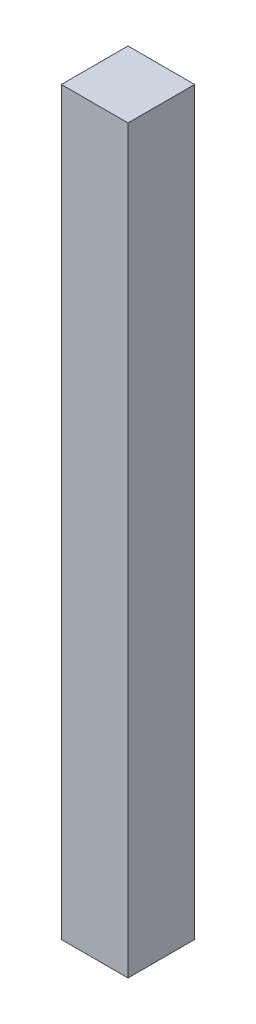
ISO-10303-21;
HEADER;
FILE_DESCRIPTION(('STEP AP214'),'2;1');
FILE_NAME('part.step','',(''),(''),'','','');
FILE_SCHEMA(('AUTOMOTIVE_DESIGN { 1 0 10303 214 1 1 1 1 }'));
ENDSEC;
DATA;
#1=APPLICATION_CONTEXT('core data for automotive mechanical design processes');
#2=APPLICATION_PROTOCOL_DEFINITION('international standard','automotive_design',2000,#1);
#3=PRODUCT_CONTEXT('',#1,'mechanical');
#4=PRODUCT('Part','Part','',(#3));
#5=PRODUCT_RELATED_PRODUCT_CATEGORY('part','',(#4));
#6=PRODUCT_DEFINITION_FORMATION('','',#4);
#7=PRODUCT_DEFINITION_CONTEXT('part definition',#1,'design');
#8=PRODUCT_DEFINITION('design','',#6,#7);
#9=PRODUCT_DEFINITION_SHAPE('','',#8);
#10=(LENGTH_UNIT() NAMED_UNIT(*) SI_UNIT(.MILLI.,.METRE.));
#11=(NAMED_UNIT(*) PLANE_ANGLE_UNIT() SI_UNIT($,.RADIAN.));
#12=(NAMED_UNIT(*) SI_UNIT($,.STERADIAN.) SOLID_ANGLE_UNIT());
#13=UNCERTAINTY_MEASURE_WITH_UNIT(LENGTH_MEASURE(1.E-05),#10,'distance_accuracy_value','');
#14=(GEOMETRIC_REPRESENTATION_CONTEXT(3) GLOBAL_UNCERTAINTY_ASSIGNED_CONTEXT((#13)) GLOBAL_UNIT_ASSIGNED_CONTEXT((#10,
#11,#12)) REPRESENTATION_CONTEXT('',''));
#15=CARTESIAN_POINT('',(0.,0.,0.));
#16=DIRECTION('',(0.,0.,1.));
#17=DIRECTION('',(1.,0.,0.));
#18=AXIS2_PLACEMENT_3D('',#15,#16,#17);
#19=CARTESIAN_POINT('',(637.,1180.,26.));
#20=DIRECTION('',(1.,0.,0.));
#21=DIRECTION('',(0.,0.,-1.));
#22=AXIS2_PLACEMENT_3D('',#19,#20,#21);
#23=PLANE('',#22);
#24=DIRECTION('',(0.,-1.,0.));
#25=VECTOR('',#24,1.);
#26=CARTESIAN_POINT('',(637.,1180.,8.));
#27=LINE('',#26,#25);
#28=CARTESIAN_POINT('',(637.,1380.,8.));
#29=VERTEX_POINT('',#28);
#30=CARTESIAN_POINT('',(637.,1180.,8.));
#31=VERTEX_POINT('',#30);
#32=EDGE_CURVE('E102',#29,#31,#27,.T.);
#33=ORIENTED_EDGE('',*,*,#32,.T.);
#34=DIRECTION('',(0.,0.,-1.));
#35=VECTOR('',#34,1.);
#36=CARTESIAN_POINT('',(637.,1180.,26.));
#37=LINE('',#36,#35);
#38=CARTESIAN_POINT('',(637.,1180.,26.));
#39=VERTEX_POINT('',#38);
#40=EDGE_CURVE('E11',#39,#31,#37,.T.);
#41=ORIENTED_EDGE('',*,*,#40,.F.);
#42=DIRECTION('',(0.,-1.,0.));
#43=VECTOR('',#42,1.);
#44=CARTESIAN_POINT('',(637.,1180.,26.));
#45=LINE('',#44,#43);
#46=CARTESIAN_POINT('',(637.,1380.,26.));
#47=VERTEX_POINT('',#46);
#48=EDGE_CURVE('E90',#47,#39,#45,.T.);
#49=ORIENTED_EDGE('',*,*,#48,.F.);
#50=DIRECTION('',(0.,0.,-1.));
#51=VECTOR('',#50,1.);
#52=CARTESIAN_POINT('',(637.,1380.,26.));
#53=LINE('',#52,#51);
#54=EDGE_CURVE('E98',#47,#29,#53,.T.);
#55=ORIENTED_EDGE('',*,*,#54,.T.);
#56=EDGE_LOOP('',(#33,#41,#49,#55));
#57=FACE_BOUND('',#56,.T.);
#58=ADVANCED_FACE('F39',(#57),#23,.F.);
#59=CARTESIAN_POINT('',(637.,1180.,26.));
#60=DIRECTION('',(0.,1.,0.));
#61=DIRECTION('',(0.,0.,1.));
#62=AXIS2_PLACEMENT_3D('',#59,#60,#61);
#63=PLANE('',#62);
#64=DIRECTION('',(1.,0.,0.));
#65=VECTOR('',#64,1.);
#66=CARTESIAN_POINT('',(637.,1180.,8.));
#67=LINE('',#66,#65);
#68=CARTESIAN_POINT('',(655.,1180.,8.));
#69=VERTEX_POINT('',#68);
#70=EDGE_CURVE('E94',#31,#69,#67,.T.);
#71=ORIENTED_EDGE('',*,*,#70,.T.);
#72=DIRECTION('',(0.,0.,-1.));
#73=VECTOR('',#72,1.);
#74=CARTESIAN_POINT('',(655.,1180.,26.));
#75=LINE('',#74,#73);
#76=CARTESIAN_POINT('',(655.,1180.,26.));
#77=VERTEX_POINT('',#76);
#78=EDGE_CURVE('E47',#77,#69,#75,.T.);
#79=ORIENTED_EDGE('',*,*,#78,.F.);
#80=DIRECTION('',(1.,0.,0.));
#81=VECTOR('',#80,1.);
#82=CARTESIAN_POINT('',(637.,1180.,26.));
#83=LINE('',#82,#81);
#84=EDGE_CURVE('E85',#39,#77,#83,.T.);
#85=ORIENTED_EDGE('',*,*,#84,.F.);
#86=ORIENTED_EDGE('',*,*,#40,.T.);
#87=EDGE_LOOP('',(#71,#79,#85,#86));
#88=FACE_BOUND('',#87,.T.);
#89=ADVANCED_FACE('F93',(#88),#63,.F.);
#90=CARTESIAN_POINT('',(655.,1180.,26.));
#91=DIRECTION('',(-1.,0.,0.));
#92=DIRECTION('',(0.,0.,1.));
#93=AXIS2_PLACEMENT_3D('',#90,#91,#92);
#94=PLANE('',#93);
#95=DIRECTION('',(0.,1.,0.));
#96=VECTOR('',#95,1.);
#97=CARTESIAN_POINT('',(655.,1180.,8.));
#98=LINE('',#97,#96);
#99=CARTESIAN_POINT('',(655.,1380.,8.));
#100=VERTEX_POINT('',#99);
#101=EDGE_CURVE('E72',#69,#100,#98,.T.);
#102=ORIENTED_EDGE('',*,*,#101,.T.);
#103=DIRECTION('',(0.,0.,-1.));
#104=VECTOR('',#103,1.);
#105=CARTESIAN_POINT('',(655.,1380.,26.));
#106=LINE('',#105,#104);
#107=CARTESIAN_POINT('',(655.,1380.,26.));
#108=VERTEX_POINT('',#107);
#109=EDGE_CURVE('E95',#108,#100,#106,.T.);
#110=ORIENTED_EDGE('',*,*,#109,.F.);
#111=DIRECTION('',(0.,1.,0.));
#112=VECTOR('',#111,1.);
#113=CARTESIAN_POINT('',(655.,1180.,26.));
#114=LINE('',#113,#112);
#115=EDGE_CURVE('E88',#77,#108,#114,.T.);
#116=ORIENTED_EDGE('',*,*,#115,.F.);
#117=ORIENTED_EDGE('',*,*,#78,.T.);
#118=EDGE_LOOP('',(#102,#110,#116,#117));
#119=FACE_BOUND('',#118,.T.);
#120=ADVANCED_FACE('F96',(#119),#94,.F.);
#121=CARTESIAN_POINT('',(637.,1380.,26.));
#122=DIRECTION('',(0.,-1.,0.));
#123=DIRECTION('',(0.,0.,-1.));
#124=AXIS2_PLACEMENT_3D('',#121,#122,#123);
#125=PLANE('',#124);
#126=DIRECTION('',(-1.,0.,0.));
#127=VECTOR('',#126,1.);
#128=CARTESIAN_POINT('',(637.,1380.,8.));
#129=LINE('',#128,#127);
#130=EDGE_CURVE('E78',#100,#29,#129,.T.);
#131=ORIENTED_EDGE('',*,*,#130,.T.);
#132=ORIENTED_EDGE('',*,*,#54,.F.);
#133=DIRECTION('',(-1.,0.,0.));
#134=VECTOR('',#133,1.);
#135=CARTESIAN_POINT('',(637.,1380.,26.));
#136=LINE('',#135,#134);
#137=EDGE_CURVE('E55',#108,#47,#136,.T.);
#138=ORIENTED_EDGE('',*,*,#137,.F.);
#139=ORIENTED_EDGE('',*,*,#109,.T.);
#140=EDGE_LOOP('',(#131,#132,#138,#139));
#141=FACE_BOUND('',#140,.T.);
#142=ADVANCED_FACE('F109',(#141),#125,.F.);
#143=CARTESIAN_POINT('',(0.,0.,26.));
#144=DIRECTION('',(0.,0.,-1.));
#145=DIRECTION('',(-1.,0.,0.));
#146=AXIS2_PLACEMENT_3D('',#143,#144,#145);
#147=PLANE('',#146);
#148=ORIENTED_EDGE('',*,*,#48,.T.);
#149=ORIENTED_EDGE('',*,*,#84,.T.);
#150=ORIENTED_EDGE('',*,*,#115,.T.);
#151=ORIENTED_EDGE('',*,*,#137,.T.);
#152=EDGE_LOOP('',(#148,#149,#150,#151));
#153=FACE_BOUND('',#152,.T.);
#154=ADVANCED_FACE('F86',(#153),#147,.F.);
#155=CARTESIAN_POINT('',(0.,0.,8.));
#156=DIRECTION('',(0.,0.,-1.));
#157=DIRECTION('',(-1.,0.,0.));
#158=AXIS2_PLACEMENT_3D('',#155,#156,#157);
#159=PLANE('',#158);
#160=ORIENTED_EDGE('',*,*,#32,.F.);
#161=ORIENTED_EDGE('',*,*,#130,.F.);
#162=ORIENTED_EDGE('',*,*,#101,.F.);
#163=ORIENTED_EDGE('',*,*,#70,.F.);
#164=EDGE_LOOP('',(#160,#161,#162,#163));
#165=FACE_BOUND('',#164,.T.);
#166=ADVANCED_FACE('F112',(#165),#159,.T.);
#167=CLOSED_SHELL('',(#58,#89,#120,#142,#154,#166));
#168=MANIFOLD_SOLID_BREP('B2',#167);
#169=ADVANCED_BREP_SHAPE_REPRESENTATION('',(#18,#168),#14);
#170=SHAPE_DEFINITION_REPRESENTATION(#9,#169);
ENDSEC;
END-ISO-10303-21;
